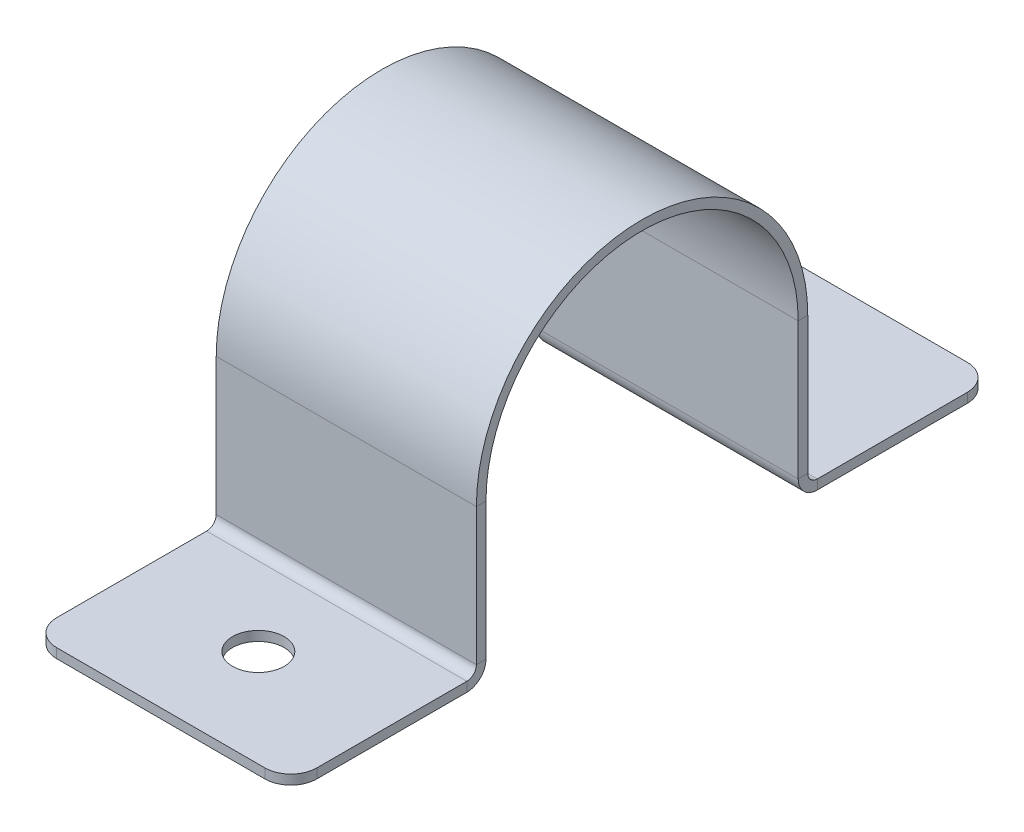
ISO-10303-21;
HEADER;
FILE_DESCRIPTION(('STEP AP214'),'2;1');
FILE_NAME('part.step','',(''),(''),'','','');
FILE_SCHEMA(('AUTOMOTIVE_DESIGN { 1 0 10303 214 1 1 1 1 }'));
ENDSEC;
DATA;
#1=APPLICATION_CONTEXT('core data for automotive mechanical design processes');
#2=APPLICATION_PROTOCOL_DEFINITION('international standard','automotive_design',2000,#1);
#3=PRODUCT_CONTEXT('',#1,'mechanical');
#4=PRODUCT('Part','Part','',(#3));
#5=PRODUCT_RELATED_PRODUCT_CATEGORY('part','',(#4));
#6=PRODUCT_DEFINITION_FORMATION('','',#4);
#7=PRODUCT_DEFINITION_CONTEXT('part definition',#1,'design');
#8=PRODUCT_DEFINITION('design','',#6,#7);
#9=PRODUCT_DEFINITION_SHAPE('','',#8);
#10=(LENGTH_UNIT() NAMED_UNIT(*) SI_UNIT(.MILLI.,.METRE.));
#11=(NAMED_UNIT(*) PLANE_ANGLE_UNIT() SI_UNIT($,.RADIAN.));
#12=(NAMED_UNIT(*) SI_UNIT($,.STERADIAN.) SOLID_ANGLE_UNIT());
#13=UNCERTAINTY_MEASURE_WITH_UNIT(LENGTH_MEASURE(1.E-05),#10,'distance_accuracy_value','');
#14=(GEOMETRIC_REPRESENTATION_CONTEXT(3) GLOBAL_UNCERTAINTY_ASSIGNED_CONTEXT((#13)) GLOBAL_UNIT_ASSIGNED_CONTEXT((#10,
#11,#12)) REPRESENTATION_CONTEXT('',''));
#15=CARTESIAN_POINT('',(0.,0.,0.));
#16=DIRECTION('',(0.,0.,1.));
#17=DIRECTION('',(1.,0.,0.));
#18=AXIS2_PLACEMENT_3D('',#15,#16,#17);
#19=CARTESIAN_POINT('',(10.,0.,-12.));
#20=DIRECTION('',(0.,1.,0.));
#21=DIRECTION('',(0.,0.,1.));
#22=AXIS2_PLACEMENT_3D('',#19,#20,#21);
#23=PLANE('',#22);
#24=DIRECTION('',(0.,0.,-1.));
#25=VECTOR('',#24,1.);
#26=CARTESIAN_POINT('',(-10.,0.,-12.));
#27=LINE('',#26,#25);
#28=CARTESIAN_POINT('',(-10.,0.,-13.4732));
#29=VERTEX_POINT('',#28);
#30=CARTESIAN_POINT('',(-10.,0.,-25.));
#31=VERTEX_POINT('',#30);
#32=EDGE_CURVE('E250',#29,#31,#27,.T.);
#33=ORIENTED_EDGE('',*,*,#32,.T.);
#34=CARTESIAN_POINT('',(-8.,0.,-25.));
#35=DIRECTION('',(0.,1.,0.));
#36=DIRECTION('',(0.,0.,1.));
#37=AXIS2_PLACEMENT_3D('',#34,#35,#36);
#38=CIRCLE('',#37,2.);
#39=CARTESIAN_POINT('',(-8.,0.,-27.));
#40=VERTEX_POINT('',#39);
#41=EDGE_CURVE('E360',#31,#40,#38,.F.);
#42=ORIENTED_EDGE('',*,*,#41,.T.);
#43=DIRECTION('',(-1.,0.,0.));
#44=VECTOR('',#43,1.);
#45=CARTESIAN_POINT('',(10.,0.,-27.));
#46=LINE('',#45,#44);
#47=CARTESIAN_POINT('',(8.,0.,-27.));
#48=VERTEX_POINT('',#47);
#49=EDGE_CURVE('E324',#48,#40,#46,.T.);
#50=ORIENTED_EDGE('',*,*,#49,.F.);
#51=CARTESIAN_POINT('',(8.,0.,-25.));
#52=DIRECTION('',(0.,1.,0.));
#53=DIRECTION('',(0.,0.,1.));
#54=AXIS2_PLACEMENT_3D('',#51,#52,#53);
#55=CIRCLE('',#54,2.);
#56=CARTESIAN_POINT('',(10.,0.,-25.));
#57=VERTEX_POINT('',#56);
#58=EDGE_CURVE('E352',#48,#57,#55,.F.);
#59=ORIENTED_EDGE('',*,*,#58,.T.);
#60=DIRECTION('',(0.,0.,-1.));
#61=VECTOR('',#60,1.);
#62=CARTESIAN_POINT('',(10.,0.,-12.));
#63=LINE('',#62,#61);
#64=CARTESIAN_POINT('',(10.,0.,-13.4732));
#65=VERTEX_POINT('',#64);
#66=EDGE_CURVE('E213',#65,#57,#63,.T.);
#67=ORIENTED_EDGE('',*,*,#66,.F.);
#68=DIRECTION('',(-1.,0.,0.));
#69=VECTOR('',#68,1.);
#70=CARTESIAN_POINT('',(10.,0.,-13.4732));
#71=LINE('',#70,#69);
#72=EDGE_CURVE('E249',#65,#29,#71,.T.);
#73=ORIENTED_EDGE('',*,*,#72,.T.);
#74=EDGE_LOOP('',(#33,#42,#50,#59,#67,#73));
#75=FACE_BOUND('',#74,.T.);
#76=CARTESIAN_POINT('',(0.,0.,-19.5));
#77=DIRECTION('',(0.,-1.,0.));
#78=DIRECTION('',(0.,0.,-1.));
#79=AXIS2_PLACEMENT_3D('',#76,#77,#78);
#80=CIRCLE('',#79,1.984375);
#81=CARTESIAN_POINT('',(0.,0.,-21.484375));
#82=VERTEX_POINT('',#81);
#83=EDGE_CURVE('E443',#82,#82,#80,.T.);
#84=ORIENTED_EDGE('',*,*,#83,.F.);
#85=EDGE_LOOP('',(#84));
#86=FACE_BOUND('',#85,.T.);
#87=ADVANCED_FACE('F38',(#75,#86),#23,.F.);
#88=CARTESIAN_POINT('',(10.,0.736600000000001,-12.));
#89=DIRECTION('',(0.,1.,0.));
#90=DIRECTION('',(0.,0.,1.));
#91=AXIS2_PLACEMENT_3D('',#88,#89,#90);
#92=PLANE('',#91);
#93=DIRECTION('',(-1.,0.,0.));
#94=VECTOR('',#93,1.);
#95=CARTESIAN_POINT('',(10.,0.7366,-27.));
#96=LINE('',#95,#94);
#97=CARTESIAN_POINT('',(8.,0.7366,-27.));
#98=VERTEX_POINT('',#97);
#99=CARTESIAN_POINT('',(-8.,0.7366,-27.));
#100=VERTEX_POINT('',#99);
#101=EDGE_CURVE('E207',#98,#100,#96,.T.);
#102=ORIENTED_EDGE('',*,*,#101,.T.);
#103=CARTESIAN_POINT('',(-8.,0.7366,-25.));
#104=DIRECTION('',(0.,1.,0.));
#105=DIRECTION('',(0.,0.,1.));
#106=AXIS2_PLACEMENT_3D('',#103,#104,#105);
#107=CIRCLE('',#106,2.);
#108=CARTESIAN_POINT('',(-10.,0.7366,-25.));
#109=VERTEX_POINT('',#108);
#110=EDGE_CURVE('E364',#100,#109,#107,.T.);
#111=ORIENTED_EDGE('',*,*,#110,.T.);
#112=DIRECTION('',(0.,0.,-1.));
#113=VECTOR('',#112,1.);
#114=CARTESIAN_POINT('',(-10.,0.736600000000001,-12.));
#115=LINE('',#114,#113);
#116=CARTESIAN_POINT('',(-10.,0.736600000000001,-13.4732));
#117=VERTEX_POINT('',#116);
#118=EDGE_CURVE('E203',#117,#109,#115,.T.);
#119=ORIENTED_EDGE('',*,*,#118,.F.);
#120=DIRECTION('',(-1.,0.,0.));
#121=VECTOR('',#120,1.);
#122=CARTESIAN_POINT('',(10.,0.736600000000001,-13.4732));
#123=LINE('',#122,#121);
#124=CARTESIAN_POINT('',(10.,0.736600000000001,-13.4732));
#125=VERTEX_POINT('',#124);
#126=EDGE_CURVE('E196',#125,#117,#123,.T.);
#127=ORIENTED_EDGE('',*,*,#126,.F.);
#128=DIRECTION('',(0.,0.,-1.));
#129=VECTOR('',#128,1.);
#130=CARTESIAN_POINT('',(10.,0.736600000000001,-12.));
#131=LINE('',#130,#129);
#132=CARTESIAN_POINT('',(10.,0.7366,-25.));
#133=VERTEX_POINT('',#132);
#134=EDGE_CURVE('E200',#125,#133,#131,.T.);
#135=ORIENTED_EDGE('',*,*,#134,.T.);
#136=CARTESIAN_POINT('',(8.,0.7366,-25.));
#137=DIRECTION('',(0.,1.,0.));
#138=DIRECTION('',(0.,0.,1.));
#139=AXIS2_PLACEMENT_3D('',#136,#137,#138);
#140=CIRCLE('',#139,2.);
#141=EDGE_CURVE('E355',#133,#98,#140,.T.);
#142=ORIENTED_EDGE('',*,*,#141,.T.);
#143=EDGE_LOOP('',(#102,#111,#119,#127,#135,#142));
#144=FACE_BOUND('',#143,.T.);
#145=CARTESIAN_POINT('',(0.,0.7366,-19.5));
#146=DIRECTION('',(0.,-1.,0.));
#147=DIRECTION('',(0.,0.,-1.));
#148=AXIS2_PLACEMENT_3D('',#145,#146,#147);
#149=CIRCLE('',#148,1.984375);
#150=CARTESIAN_POINT('',(0.,0.7366,-21.484375));
#151=VERTEX_POINT('',#150);
#152=EDGE_CURVE('E446',#151,#151,#149,.T.);
#153=ORIENTED_EDGE('',*,*,#152,.T.);
#154=EDGE_LOOP('',(#153));
#155=FACE_BOUND('',#154,.T.);
#156=ADVANCED_FACE('F198',(#144,#155),#92,.T.);
#157=CARTESIAN_POINT('',(10.,12.,12.));
#158=DIRECTION('',(1.,0.,0.));
#159=DIRECTION('',(0.,0.,-1.));
#160=AXIS2_PLACEMENT_3D('',#157,#158,#159);
#161=PLANE('',#160);
#162=DIRECTION('',(0.,0.,1.));
#163=VECTOR('',#162,1.);
#164=CARTESIAN_POINT('',(10.,12.,12.));
#165=LINE('',#164,#163);
#166=CARTESIAN_POINT('',(10.,12.,12.));
#167=VERTEX_POINT('',#166);
#168=CARTESIAN_POINT('',(10.,12.,12.7366));
#169=VERTEX_POINT('',#168);
#170=EDGE_CURVE('E347',#167,#169,#165,.T.);
#171=ORIENTED_EDGE('',*,*,#170,.F.);
#172=CARTESIAN_POINT('',(10.,12.,0.));
#173=DIRECTION('',(-1.,0.,0.));
#174=DIRECTION('',(0.,0.,1.));
#175=AXIS2_PLACEMENT_3D('',#172,#173,#174);
#176=CIRCLE('',#175,12.);
#177=CARTESIAN_POINT('',(10.,12.,-12.));
#178=VERTEX_POINT('',#177);
#179=EDGE_CURVE('E242',#167,#178,#176,.T.);
#180=ORIENTED_EDGE('',*,*,#179,.T.);
#181=DIRECTION('',(0.,0.,1.));
#182=VECTOR('',#181,1.);
#183=CARTESIAN_POINT('',(10.,12.,-12.7366));
#184=LINE('',#183,#182);
#185=CARTESIAN_POINT('',(10.,12.,-12.7366));
#186=VERTEX_POINT('',#185);
#187=EDGE_CURVE('E345',#186,#178,#184,.T.);
#188=ORIENTED_EDGE('',*,*,#187,.F.);
#189=CARTESIAN_POINT('',(10.,12.,0.));
#190=DIRECTION('',(1.,0.,0.));
#191=DIRECTION('',(0.,0.,-1.));
#192=AXIS2_PLACEMENT_3D('',#189,#190,#191);
#193=CIRCLE('',#192,12.7366);
#194=EDGE_CURVE('E220',#169,#186,#193,.F.);
#195=ORIENTED_EDGE('',*,*,#194,.F.);
#196=EDGE_LOOP('',(#171,#180,#188,#195));
#197=FACE_BOUND('',#196,.T.);
#198=ADVANCED_FACE('F416',(#197),#161,.T.);
#199=CARTESIAN_POINT('',(10.,12.,-12.7366));
#200=DIRECTION('',(1.,0.,0.));
#201=DIRECTION('',(0.,0.,-1.));
#202=AXIS2_PLACEMENT_3D('',#199,#200,#201);
#203=PLANE('',#202);
#204=DIRECTION('',(0.,1.,0.));
#205=VECTOR('',#204,1.);
#206=CARTESIAN_POINT('',(10.,0.,12.));
#207=LINE('',#206,#205);
#208=CARTESIAN_POINT('',(10.,1.4732,12.));
#209=VERTEX_POINT('',#208);
#210=EDGE_CURVE('E239',#209,#167,#207,.T.);
#211=ORIENTED_EDGE('',*,*,#210,.T.);
#212=ORIENTED_EDGE('',*,*,#170,.T.);
#213=DIRECTION('',(0.,1.,0.));
#214=VECTOR('',#213,1.);
#215=CARTESIAN_POINT('',(10.,0.,12.7366));
#216=LINE('',#215,#214);
#217=CARTESIAN_POINT('',(10.,1.4732,12.7366));
#218=VERTEX_POINT('',#217);
#219=EDGE_CURVE('E226',#218,#169,#216,.T.);
#220=ORIENTED_EDGE('',*,*,#219,.F.);
#221=DIRECTION('',(0.,0.,-1.));
#222=VECTOR('',#221,1.);
#223=CARTESIAN_POINT('',(10.,1.4732,12.7366));
#224=LINE('',#223,#222);
#225=EDGE_CURVE('E336',#218,#209,#224,.T.);
#226=ORIENTED_EDGE('',*,*,#225,.T.);
#227=EDGE_LOOP('',(#211,#212,#220,#226));
#228=FACE_BOUND('',#227,.T.);
#229=ADVANCED_FACE('F407',(#228),#203,.T.);
#230=CARTESIAN_POINT('',(-10.,12.,-12.));
#231=DIRECTION('',(-1.,0.,0.));
#232=DIRECTION('',(0.,0.,1.));
#233=AXIS2_PLACEMENT_3D('',#230,#231,#232);
#234=PLANE('',#233);
#235=DIRECTION('',(0.,0.,-1.));
#236=VECTOR('',#235,1.);
#237=CARTESIAN_POINT('',(-10.,12.,-12.));
#238=LINE('',#237,#236);
#239=CARTESIAN_POINT('',(-10.,12.,-12.));
#240=VERTEX_POINT('',#239);
#241=CARTESIAN_POINT('',(-10.,12.,-12.7366));
#242=VERTEX_POINT('',#241);
#243=EDGE_CURVE('E343',#240,#242,#238,.T.);
#244=ORIENTED_EDGE('',*,*,#243,.F.);
#245=CARTESIAN_POINT('',(-10.,12.,0.));
#246=DIRECTION('',(-1.,0.,0.));
#247=DIRECTION('',(0.,0.,1.));
#248=AXIS2_PLACEMENT_3D('',#245,#246,#247);
#249=CIRCLE('',#248,12.);
#250=CARTESIAN_POINT('',(-10.,12.,12.));
#251=VERTEX_POINT('',#250);
#252=EDGE_CURVE('E279',#251,#240,#249,.T.);
#253=ORIENTED_EDGE('',*,*,#252,.F.);
#254=DIRECTION('',(0.,0.,-1.));
#255=VECTOR('',#254,1.);
#256=CARTESIAN_POINT('',(-10.,12.,12.7366));
#257=LINE('',#256,#255);
#258=CARTESIAN_POINT('',(-10.,12.,12.7366));
#259=VERTEX_POINT('',#258);
#260=EDGE_CURVE('E341',#259,#251,#257,.T.);
#261=ORIENTED_EDGE('',*,*,#260,.F.);
#262=CARTESIAN_POINT('',(-10.,12.,0.));
#263=DIRECTION('',(1.,0.,0.));
#264=DIRECTION('',(0.,0.,-1.));
#265=AXIS2_PLACEMENT_3D('',#262,#263,#264);
#266=CIRCLE('',#265,12.7366);
#267=EDGE_CURVE('E260',#259,#242,#266,.F.);
#268=ORIENTED_EDGE('',*,*,#267,.T.);
#269=EDGE_LOOP('',(#244,#253,#261,#268));
#270=FACE_BOUND('',#269,.T.);
#271=ADVANCED_FACE('F490',(#270),#234,.T.);
#272=CARTESIAN_POINT('',(-10.,12.,12.7366));
#273=DIRECTION('',(-1.,0.,0.));
#274=DIRECTION('',(0.,0.,1.));
#275=AXIS2_PLACEMENT_3D('',#272,#273,#274);
#276=PLANE('',#275);
#277=DIRECTION('',(0.,-1.,0.));
#278=VECTOR('',#277,1.);
#279=CARTESIAN_POINT('',(-10.,12.,-12.));
#280=LINE('',#279,#278);
#281=CARTESIAN_POINT('',(-10.,1.4732,-12.));
#282=VERTEX_POINT('',#281);
#283=EDGE_CURVE('E282',#240,#282,#280,.T.);
#284=ORIENTED_EDGE('',*,*,#283,.F.);
#285=ORIENTED_EDGE('',*,*,#243,.T.);
#286=DIRECTION('',(0.,-1.,0.));
#287=VECTOR('',#286,1.);
#288=CARTESIAN_POINT('',(-10.,12.,-12.7366));
#289=LINE('',#288,#287);
#290=CARTESIAN_POINT('',(-10.,1.4732,-12.7366));
#291=VERTEX_POINT('',#290);
#292=EDGE_CURVE('E257',#242,#291,#289,.T.);
#293=ORIENTED_EDGE('',*,*,#292,.T.);
#294=DIRECTION('',(0.,0.,1.));
#295=VECTOR('',#294,1.);
#296=CARTESIAN_POINT('',(-10.,1.4732,-12.7366));
#297=LINE('',#296,#295);
#298=EDGE_CURVE('E327',#291,#282,#297,.T.);
#299=ORIENTED_EDGE('',*,*,#298,.T.);
#300=EDGE_LOOP('',(#284,#285,#293,#299));
#301=FACE_BOUND('',#300,.T.);
#302=ADVANCED_FACE('F487',(#301),#276,.T.);
#303=CARTESIAN_POINT('',(10.,0.,13.4732));
#304=DIRECTION('',(1.,0.,0.));
#305=DIRECTION('',(0.,0.,-1.));
#306=AXIS2_PLACEMENT_3D('',#303,#304,#305);
#307=PLANE('',#306);
#308=DIRECTION('',(0.,1.,0.));
#309=VECTOR('',#308,1.);
#310=CARTESIAN_POINT('',(10.,0.,13.4732));
#311=LINE('',#310,#309);
#312=CARTESIAN_POINT('',(10.,0.,13.4732));
#313=VERTEX_POINT('',#312);
#314=CARTESIAN_POINT('',(10.,0.7366,13.4732));
#315=VERTEX_POINT('',#314);
#316=EDGE_CURVE('E338',#313,#315,#311,.T.);
#317=ORIENTED_EDGE('',*,*,#316,.F.);
#318=CARTESIAN_POINT('',(10.,1.4732,13.4732));
#319=DIRECTION('',(-1.,0.,0.));
#320=DIRECTION('',(0.,0.,1.));
#321=AXIS2_PLACEMENT_3D('',#318,#319,#320);
#322=CIRCLE('',#321,1.4732);
#323=EDGE_CURVE('E236',#313,#209,#322,.F.);
#324=ORIENTED_EDGE('',*,*,#323,.T.);
#325=ORIENTED_EDGE('',*,*,#225,.F.);
#326=CARTESIAN_POINT('',(10.,1.4732,13.4732));
#327=DIRECTION('',(1.,0.,0.));
#328=DIRECTION('',(0.,0.,-1.));
#329=AXIS2_PLACEMENT_3D('',#326,#327,#328);
#330=CIRCLE('',#329,0.7366);
#331=EDGE_CURVE('E229',#315,#218,#330,.T.);
#332=ORIENTED_EDGE('',*,*,#331,.F.);
#333=EDGE_LOOP('',(#317,#324,#325,#332));
#334=FACE_BOUND('',#333,.T.);
#335=ADVANCED_FACE('F398',(#334),#307,.T.);
#336=CARTESIAN_POINT('',(10.,1.4732,12.7366));
#337=DIRECTION('',(1.,0.,0.));
#338=DIRECTION('',(0.,0.,-1.));
#339=AXIS2_PLACEMENT_3D('',#336,#337,#338);
#340=PLANE('',#339);
#341=DIRECTION('',(0.,0.,-1.));
#342=VECTOR('',#341,1.);
#343=CARTESIAN_POINT('',(10.,0.7366,27.));
#344=LINE('',#343,#342);
#345=CARTESIAN_POINT('',(10.,0.7366,25.));
#346=VERTEX_POINT('',#345);
#347=EDGE_CURVE('E232',#346,#315,#344,.T.);
#348=ORIENTED_EDGE('',*,*,#347,.F.);
#349=DIRECTION('',(0.,1.,0.));
#350=VECTOR('',#349,1.);
#351=CARTESIAN_POINT('',(10.,1.4732,25.));
#352=LINE('',#351,#350);
#353=CARTESIAN_POINT('',(10.,0.,25.));
#354=VERTEX_POINT('',#353);
#355=EDGE_CURVE('E61',#346,#354,#352,.F.);
#356=ORIENTED_EDGE('',*,*,#355,.T.);
#357=DIRECTION('',(0.,0.,-1.));
#358=VECTOR('',#357,1.);
#359=CARTESIAN_POINT('',(10.,0.,27.));
#360=LINE('',#359,#358);
#361=EDGE_CURVE('E234',#354,#313,#360,.T.);
#362=ORIENTED_EDGE('',*,*,#361,.T.);
#363=ORIENTED_EDGE('',*,*,#316,.T.);
#364=EDGE_LOOP('',(#348,#356,#362,#363));
#365=FACE_BOUND('',#364,.T.);
#366=ADVANCED_FACE('F389',(#365),#340,.T.);
#367=CARTESIAN_POINT('',(-10.,1.4732,12.));
#368=DIRECTION('',(-1.,0.,0.));
#369=DIRECTION('',(0.,0.,1.));
#370=AXIS2_PLACEMENT_3D('',#367,#368,#369);
#371=PLANE('',#370);
#372=DIRECTION('',(0.,0.,1.));
#373=VECTOR('',#372,1.);
#374=CARTESIAN_POINT('',(-10.,1.4732,12.));
#375=LINE('',#374,#373);
#376=CARTESIAN_POINT('',(-10.,1.4732,12.));
#377=VERTEX_POINT('',#376);
#378=CARTESIAN_POINT('',(-10.,1.4732,12.7366));
#379=VERTEX_POINT('',#378);
#380=EDGE_CURVE('E334',#377,#379,#375,.T.);
#381=ORIENTED_EDGE('',*,*,#380,.F.);
#382=CARTESIAN_POINT('',(-10.,1.4732,13.4732));
#383=DIRECTION('',(-1.,0.,0.));
#384=DIRECTION('',(0.,0.,1.));
#385=AXIS2_PLACEMENT_3D('',#382,#383,#384);
#386=CIRCLE('',#385,1.4732);
#387=CARTESIAN_POINT('',(-10.,0.,13.4732));
#388=VERTEX_POINT('',#387);
#389=EDGE_CURVE('E273',#388,#377,#386,.F.);
#390=ORIENTED_EDGE('',*,*,#389,.F.);
#391=DIRECTION('',(0.,-1.,0.));
#392=VECTOR('',#391,1.);
#393=CARTESIAN_POINT('',(-10.,0.7366,13.4732));
#394=LINE('',#393,#392);
#395=CARTESIAN_POINT('',(-10.,0.7366,13.4732));
#396=VERTEX_POINT('',#395);
#397=EDGE_CURVE('E331',#396,#388,#394,.T.);
#398=ORIENTED_EDGE('',*,*,#397,.F.);
#399=CARTESIAN_POINT('',(-10.,1.4732,13.4732));
#400=DIRECTION('',(1.,0.,0.));
#401=DIRECTION('',(0.,0.,-1.));
#402=AXIS2_PLACEMENT_3D('',#399,#400,#401);
#403=CIRCLE('',#402,0.7366);
#404=EDGE_CURVE('E266',#396,#379,#403,.T.);
#405=ORIENTED_EDGE('',*,*,#404,.T.);
#406=EDGE_LOOP('',(#381,#390,#398,#405));
#407=FACE_BOUND('',#406,.T.);
#408=ADVANCED_FACE('F478',(#407),#371,.T.);
#409=CARTESIAN_POINT('',(-10.,0.7366,13.4732));
#410=DIRECTION('',(-1.,0.,0.));
#411=DIRECTION('',(0.,0.,1.));
#412=AXIS2_PLACEMENT_3D('',#409,#410,#411);
#413=PLANE('',#412);
#414=DIRECTION('',(0.,1.,0.));
#415=VECTOR('',#414,1.);
#416=CARTESIAN_POINT('',(-10.,0.,12.));
#417=LINE('',#416,#415);
#418=EDGE_CURVE('E276',#377,#251,#417,.T.);
#419=ORIENTED_EDGE('',*,*,#418,.F.);
#420=ORIENTED_EDGE('',*,*,#380,.T.);
#421=DIRECTION('',(0.,1.,0.));
#422=VECTOR('',#421,1.);
#423=CARTESIAN_POINT('',(-10.,0.,12.7366));
#424=LINE('',#423,#422);
#425=EDGE_CURVE('E263',#379,#259,#424,.T.);
#426=ORIENTED_EDGE('',*,*,#425,.T.);
#427=ORIENTED_EDGE('',*,*,#260,.T.);
#428=EDGE_LOOP('',(#419,#420,#426,#427));
#429=FACE_BOUND('',#428,.T.);
#430=ADVANCED_FACE('F475',(#429),#413,.T.);
#431=CARTESIAN_POINT('',(10.,1.4732,-12.));
#432=DIRECTION('',(1.,0.,0.));
#433=DIRECTION('',(0.,0.,-1.));
#434=AXIS2_PLACEMENT_3D('',#431,#432,#433);
#435=PLANE('',#434);
#436=DIRECTION('',(0.,0.,-1.));
#437=VECTOR('',#436,1.);
#438=CARTESIAN_POINT('',(10.,1.4732,-12.));
#439=LINE('',#438,#437);
#440=CARTESIAN_POINT('',(10.,1.4732,-12.));
#441=VERTEX_POINT('',#440);
#442=CARTESIAN_POINT('',(10.,1.4732,-12.7366));
#443=VERTEX_POINT('',#442);
#444=EDGE_CURVE('E189',#441,#443,#439,.T.);
#445=ORIENTED_EDGE('',*,*,#444,.F.);
#446=CARTESIAN_POINT('',(10.,1.4732,-13.4732));
#447=DIRECTION('',(-1.,0.,0.));
#448=DIRECTION('',(0.,0.,1.));
#449=AXIS2_PLACEMENT_3D('',#446,#447,#448);
#450=CIRCLE('',#449,1.4732);
#451=EDGE_CURVE('E184',#441,#65,#450,.F.);
#452=ORIENTED_EDGE('',*,*,#451,.T.);
#453=DIRECTION('',(0.,-1.,0.));
#454=VECTOR('',#453,1.);
#455=CARTESIAN_POINT('',(10.,0.736600000000001,-13.4732));
#456=LINE('',#455,#454);
#457=EDGE_CURVE('E177',#125,#65,#456,.T.);
#458=ORIENTED_EDGE('',*,*,#457,.F.);
#459=CARTESIAN_POINT('',(10.,1.4732,-13.4732));
#460=DIRECTION('',(1.,0.,0.));
#461=DIRECTION('',(0.,0.,-1.));
#462=AXIS2_PLACEMENT_3D('',#459,#460,#461);
#463=CIRCLE('',#462,0.7366);
#464=EDGE_CURVE('E181',#443,#125,#463,.T.);
#465=ORIENTED_EDGE('',*,*,#464,.F.);
#466=EDGE_LOOP('',(#445,#452,#458,#465));
#467=FACE_BOUND('',#466,.T.);
#468=ADVANCED_FACE('F179',(#467),#435,.T.);
#469=CARTESIAN_POINT('',(10.,0.736600000000001,-13.4732));
#470=DIRECTION('',(1.,0.,0.));
#471=DIRECTION('',(0.,0.,-1.));
#472=AXIS2_PLACEMENT_3D('',#469,#470,#471);
#473=PLANE('',#472);
#474=DIRECTION('',(0.,-1.,0.));
#475=VECTOR('',#474,1.);
#476=CARTESIAN_POINT('',(10.,12.,-12.));
#477=LINE('',#476,#475);
#478=EDGE_CURVE('E245',#178,#441,#477,.T.);
#479=ORIENTED_EDGE('',*,*,#478,.T.);
#480=ORIENTED_EDGE('',*,*,#444,.T.);
#481=DIRECTION('',(0.,-1.,0.));
#482=VECTOR('',#481,1.);
#483=CARTESIAN_POINT('',(10.,12.,-12.7366));
#484=LINE('',#483,#482);
#485=EDGE_CURVE('E218',#186,#443,#484,.T.);
#486=ORIENTED_EDGE('',*,*,#485,.F.);
#487=ORIENTED_EDGE('',*,*,#187,.T.);
#488=EDGE_LOOP('',(#479,#480,#486,#487));
#489=FACE_BOUND('',#488,.T.);
#490=ADVANCED_FACE('F425',(#489),#473,.T.);
#491=CARTESIAN_POINT('',(-10.,0.,-13.4732));
#492=DIRECTION('',(-1.,0.,0.));
#493=DIRECTION('',(0.,0.,1.));
#494=AXIS2_PLACEMENT_3D('',#491,#492,#493);
#495=PLANE('',#494);
#496=DIRECTION('',(0.,1.,0.));
#497=VECTOR('',#496,1.);
#498=CARTESIAN_POINT('',(-10.,0.,-13.4732));
#499=LINE('',#498,#497);
#500=EDGE_CURVE('E190',#29,#117,#499,.T.);
#501=ORIENTED_EDGE('',*,*,#500,.F.);
#502=CARTESIAN_POINT('',(-10.,1.4732,-13.4732));
#503=DIRECTION('',(-1.,0.,0.));
#504=DIRECTION('',(0.,0.,1.));
#505=AXIS2_PLACEMENT_3D('',#502,#503,#504);
#506=CIRCLE('',#505,1.4732);
#507=EDGE_CURVE('E285',#282,#29,#506,.F.);
#508=ORIENTED_EDGE('',*,*,#507,.F.);
#509=ORIENTED_EDGE('',*,*,#298,.F.);
#510=CARTESIAN_POINT('',(-10.,1.4732,-13.4732));
#511=DIRECTION('',(1.,0.,0.));
#512=DIRECTION('',(0.,0.,-1.));
#513=AXIS2_PLACEMENT_3D('',#510,#511,#512);
#514=CIRCLE('',#513,0.7366);
#515=EDGE_CURVE('E255',#291,#117,#514,.T.);
#516=ORIENTED_EDGE('',*,*,#515,.T.);
#517=EDGE_LOOP('',(#501,#508,#509,#516));
#518=FACE_BOUND('',#517,.T.);
#519=ADVANCED_FACE('F466',(#518),#495,.T.);
#520=CARTESIAN_POINT('',(-10.,1.4732,-12.7366));
#521=DIRECTION('',(-1.,0.,0.));
#522=DIRECTION('',(0.,0.,1.));
#523=AXIS2_PLACEMENT_3D('',#520,#521,#522);
#524=PLANE('',#523);
#525=ORIENTED_EDGE('',*,*,#118,.T.);
#526=DIRECTION('',(0.,-1.,0.));
#527=VECTOR('',#526,1.);
#528=CARTESIAN_POINT('',(-10.,1.4732,-25.));
#529=LINE('',#528,#527);
#530=EDGE_CURVE('E357',#109,#31,#529,.T.);
#531=ORIENTED_EDGE('',*,*,#530,.T.);
#532=ORIENTED_EDGE('',*,*,#32,.F.);
#533=ORIENTED_EDGE('',*,*,#500,.T.);
#534=EDGE_LOOP('',(#525,#531,#532,#533));
#535=FACE_BOUND('',#534,.T.);
#536=ADVANCED_FACE('F463',(#535),#524,.T.);
#537=CARTESIAN_POINT('',(10.,0.7366,-27.));
#538=DIRECTION('',(0.,0.,-1.));
#539=DIRECTION('',(-1.,0.,0.));
#540=AXIS2_PLACEMENT_3D('',#537,#538,#539);
#541=PLANE('',#540);
#542=ORIENTED_EDGE('',*,*,#49,.T.);
#543=DIRECTION('',(0.,-1.,0.));
#544=VECTOR('',#543,1.);
#545=CARTESIAN_POINT('',(-8.,0.7366,-27.));
#546=LINE('',#545,#544);
#547=EDGE_CURVE('E362',#40,#100,#546,.F.);
#548=ORIENTED_EDGE('',*,*,#547,.T.);
#549=ORIENTED_EDGE('',*,*,#101,.F.);
#550=DIRECTION('',(0.,-1.,0.));
#551=VECTOR('',#550,1.);
#552=CARTESIAN_POINT('',(8.,0.7366,-27.));
#553=LINE('',#552,#551);
#554=EDGE_CURVE('E349',#98,#48,#553,.T.);
#555=ORIENTED_EDGE('',*,*,#554,.T.);
#556=EDGE_LOOP('',(#542,#548,#549,#555));
#557=FACE_BOUND('',#556,.T.);
#558=ADVANCED_FACE('F462',(#557),#541,.T.);
#559=CARTESIAN_POINT('',(10.,1.4732,-13.4732));
#560=DIRECTION('',(-1.,0.,0.));
#561=DIRECTION('',(0.,0.,1.));
#562=AXIS2_PLACEMENT_3D('',#559,#560,#561);
#563=CYLINDRICAL_SURFACE('',#562,0.7366);
#564=ORIENTED_EDGE('',*,*,#515,.F.);
#565=DIRECTION('',(-1.,0.,0.));
#566=VECTOR('',#565,1.);
#567=CARTESIAN_POINT('',(10.,1.4732,-12.7366));
#568=LINE('',#567,#566);
#569=EDGE_CURVE('E208',#443,#291,#568,.T.);
#570=ORIENTED_EDGE('',*,*,#569,.F.);
#571=ORIENTED_EDGE('',*,*,#464,.T.);
#572=ORIENTED_EDGE('',*,*,#126,.T.);
#573=EDGE_LOOP('',(#564,#570,#571,#572));
#574=FACE_BOUND('',#573,.T.);
#575=ADVANCED_FACE('F216',(#574),#563,.F.);
#576=CARTESIAN_POINT('',(10.,12.,-12.7366));
#577=DIRECTION('',(0.,0.,-1.));
#578=DIRECTION('',(0.,1.,0.));
#579=AXIS2_PLACEMENT_3D('',#576,#577,#578);
#580=PLANE('',#579);
#581=ORIENTED_EDGE('',*,*,#292,.F.);
#582=DIRECTION('',(-1.,0.,0.));
#583=VECTOR('',#582,1.);
#584=CARTESIAN_POINT('',(10.,12.,-12.7366));
#585=LINE('',#584,#583);
#586=EDGE_CURVE('E319',#186,#242,#585,.T.);
#587=ORIENTED_EDGE('',*,*,#586,.F.);
#588=ORIENTED_EDGE('',*,*,#485,.T.);
#589=ORIENTED_EDGE('',*,*,#569,.T.);
#590=EDGE_LOOP('',(#581,#587,#588,#589));
#591=FACE_BOUND('',#590,.T.);
#592=ADVANCED_FACE('F424',(#591),#580,.T.);
#593=CARTESIAN_POINT('',(10.,12.,0.));
#594=DIRECTION('',(-1.,0.,0.));
#595=DIRECTION('',(0.,0.,1.));
#596=AXIS2_PLACEMENT_3D('',#593,#594,#595);
#597=CYLINDRICAL_SURFACE('',#596,12.7366);
#598=ORIENTED_EDGE('',*,*,#267,.F.);
#599=DIRECTION('',(-1.,0.,0.));
#600=VECTOR('',#599,1.);
#601=CARTESIAN_POINT('',(10.,12.,12.7366));
#602=LINE('',#601,#600);
#603=EDGE_CURVE('E316',#169,#259,#602,.T.);
#604=ORIENTED_EDGE('',*,*,#603,.F.);
#605=ORIENTED_EDGE('',*,*,#194,.T.);
#606=ORIENTED_EDGE('',*,*,#586,.T.);
#607=EDGE_LOOP('',(#598,#604,#605,#606));
#608=FACE_BOUND('',#607,.T.);
#609=ADVANCED_FACE('F415',(#608),#597,.T.);
#610=CARTESIAN_POINT('',(10.,0.,12.7366));
#611=DIRECTION('',(0.,0.,1.));
#612=DIRECTION('',(0.,-1.,0.));
#613=AXIS2_PLACEMENT_3D('',#610,#611,#612);
#614=PLANE('',#613);
#615=ORIENTED_EDGE('',*,*,#425,.F.);
#616=DIRECTION('',(-1.,0.,0.));
#617=VECTOR('',#616,1.);
#618=CARTESIAN_POINT('',(10.,1.4732,12.7366));
#619=LINE('',#618,#617);
#620=EDGE_CURVE('E313',#218,#379,#619,.T.);
#621=ORIENTED_EDGE('',*,*,#620,.F.);
#622=ORIENTED_EDGE('',*,*,#219,.T.);
#623=ORIENTED_EDGE('',*,*,#603,.T.);
#624=EDGE_LOOP('',(#615,#621,#622,#623));
#625=FACE_BOUND('',#624,.T.);
#626=ADVANCED_FACE('F406',(#625),#614,.T.);
#627=CARTESIAN_POINT('',(10.,1.4732,13.4732));
#628=DIRECTION('',(-1.,0.,0.));
#629=DIRECTION('',(0.,0.,1.));
#630=AXIS2_PLACEMENT_3D('',#627,#628,#629);
#631=CYLINDRICAL_SURFACE('',#630,0.7366);
#632=ORIENTED_EDGE('',*,*,#404,.F.);
#633=DIRECTION('',(-1.,0.,0.));
#634=VECTOR('',#633,1.);
#635=CARTESIAN_POINT('',(10.,0.7366,13.4732));
#636=LINE('',#635,#634);
#637=EDGE_CURVE('E310',#315,#396,#636,.T.);
#638=ORIENTED_EDGE('',*,*,#637,.F.);
#639=ORIENTED_EDGE('',*,*,#331,.T.);
#640=ORIENTED_EDGE('',*,*,#620,.T.);
#641=EDGE_LOOP('',(#632,#638,#639,#640));
#642=FACE_BOUND('',#641,.T.);
#643=ADVANCED_FACE('F396',(#642),#631,.F.);
#644=CARTESIAN_POINT('',(10.,0.7366,27.));
#645=DIRECTION('',(0.,1.,0.));
#646=DIRECTION('',(0.,0.,1.));
#647=AXIS2_PLACEMENT_3D('',#644,#645,#646);
#648=PLANE('',#647);
#649=CARTESIAN_POINT('',(0.,0.7366,19.5));
#650=DIRECTION('',(0.,1.,0.));
#651=DIRECTION('',(0.,0.,1.));
#652=AXIS2_PLACEMENT_3D('',#649,#650,#651);
#653=CIRCLE('',#652,1.984375);
#654=CARTESIAN_POINT('',(0.,0.7366,21.484375));
#655=VERTEX_POINT('',#654);
#656=EDGE_CURVE('E440',#655,#655,#653,.T.);
#657=ORIENTED_EDGE('',*,*,#656,.F.);
#658=EDGE_LOOP('',(#657));
#659=FACE_BOUND('',#658,.T.);
#660=DIRECTION('',(-1.,0.,0.));
#661=VECTOR('',#660,1.);
#662=CARTESIAN_POINT('',(10.,0.7366,27.));
#663=LINE('',#662,#661);
#664=CARTESIAN_POINT('',(8.,0.7366,27.));
#665=VERTEX_POINT('',#664);
#666=CARTESIAN_POINT('',(-8.,0.7366,27.));
#667=VERTEX_POINT('',#666);
#668=EDGE_CURVE('E307',#665,#667,#663,.T.);
#669=ORIENTED_EDGE('',*,*,#668,.F.);
#670=CARTESIAN_POINT('',(8.,0.7366,25.));
#671=DIRECTION('',(0.,1.,0.));
#672=DIRECTION('',(0.,0.,1.));
#673=AXIS2_PLACEMENT_3D('',#670,#671,#672);
#674=CIRCLE('',#673,2.);
#675=EDGE_CURVE('E373',#665,#346,#674,.T.);
#676=ORIENTED_EDGE('',*,*,#675,.T.);
#677=ORIENTED_EDGE('',*,*,#347,.T.);
#678=ORIENTED_EDGE('',*,*,#637,.T.);
#679=DIRECTION('',(0.,0.,-1.));
#680=VECTOR('',#679,1.);
#681=CARTESIAN_POINT('',(-10.,0.7366,27.));
#682=LINE('',#681,#680);
#683=CARTESIAN_POINT('',(-10.,0.7366,25.));
#684=VERTEX_POINT('',#683);
#685=EDGE_CURVE('E269',#684,#396,#682,.T.);
#686=ORIENTED_EDGE('',*,*,#685,.F.);
#687=CARTESIAN_POINT('',(-8.,0.7366,25.));
#688=DIRECTION('',(0.,1.,0.));
#689=DIRECTION('',(0.,0.,1.));
#690=AXIS2_PLACEMENT_3D('',#687,#688,#689);
#691=CIRCLE('',#690,2.);
#692=EDGE_CURVE('E371',#684,#667,#691,.T.);
#693=ORIENTED_EDGE('',*,*,#692,.T.);
#694=EDGE_LOOP('',(#669,#676,#677,#678,#686,#693));
#695=FACE_BOUND('',#694,.T.);
#696=ADVANCED_FACE('F388',(#659,#695),#648,.T.);
#697=CARTESIAN_POINT('',(10.,0.,27.));
#698=DIRECTION('',(0.,0.,1.));
#699=DIRECTION('',(1.,0.,0.));
#700=AXIS2_PLACEMENT_3D('',#697,#698,#699);
#701=PLANE('',#700);
#702=DIRECTION('',(-1.,0.,0.));
#703=VECTOR('',#702,1.);
#704=CARTESIAN_POINT('',(10.,0.,27.));
#705=LINE('',#704,#703);
#706=CARTESIAN_POINT('',(8.,0.,27.));
#707=VERTEX_POINT('',#706);
#708=CARTESIAN_POINT('',(-8.,0.,27.));
#709=VERTEX_POINT('',#708);
#710=EDGE_CURVE('E305',#707,#709,#705,.T.);
#711=ORIENTED_EDGE('',*,*,#710,.F.);
#712=DIRECTION('',(0.,1.,0.));
#713=VECTOR('',#712,1.);
#714=CARTESIAN_POINT('',(8.,0.,27.));
#715=LINE('',#714,#713);
#716=EDGE_CURVE('E368',#707,#665,#715,.T.);
#717=ORIENTED_EDGE('',*,*,#716,.T.);
#718=ORIENTED_EDGE('',*,*,#668,.T.);
#719=DIRECTION('',(0.,1.,0.));
#720=VECTOR('',#719,1.);
#721=CARTESIAN_POINT('',(-8.,0.,27.));
#722=LINE('',#721,#720);
#723=EDGE_CURVE('E366',#667,#709,#722,.F.);
#724=ORIENTED_EDGE('',*,*,#723,.T.);
#725=EDGE_LOOP('',(#711,#717,#718,#724));
#726=FACE_BOUND('',#725,.T.);
#727=ADVANCED_FACE('F383',(#726),#701,.T.);
#728=CARTESIAN_POINT('',(10.,0.,27.));
#729=DIRECTION('',(0.,1.,0.));
#730=DIRECTION('',(0.,0.,1.));
#731=AXIS2_PLACEMENT_3D('',#728,#729,#730);
#732=PLANE('',#731);
#733=CARTESIAN_POINT('',(0.,0.,19.5));
#734=DIRECTION('',(0.,1.,0.));
#735=DIRECTION('',(0.,0.,1.));
#736=AXIS2_PLACEMENT_3D('',#733,#734,#735);
#737=CIRCLE('',#736,1.984375);
#738=CARTESIAN_POINT('',(0.,0.,21.484375));
#739=VERTEX_POINT('',#738);
#740=EDGE_CURVE('E253',#739,#739,#737,.T.);
#741=ORIENTED_EDGE('',*,*,#740,.T.);
#742=EDGE_LOOP('',(#741));
#743=FACE_BOUND('',#742,.T.);
#744=ORIENTED_EDGE('',*,*,#361,.F.);
#745=CARTESIAN_POINT('',(8.,0.,25.));
#746=DIRECTION('',(0.,1.,0.));
#747=DIRECTION('',(0.,0.,1.));
#748=AXIS2_PLACEMENT_3D('',#745,#746,#747);
#749=CIRCLE('',#748,2.);
#750=EDGE_CURVE('E46',#354,#707,#749,.F.);
#751=ORIENTED_EDGE('',*,*,#750,.T.);
#752=ORIENTED_EDGE('',*,*,#710,.T.);
#753=CARTESIAN_POINT('',(-8.,0.,25.));
#754=DIRECTION('',(0.,1.,0.));
#755=DIRECTION('',(0.,0.,1.));
#756=AXIS2_PLACEMENT_3D('',#753,#754,#755);
#757=CIRCLE('',#756,2.);
#758=CARTESIAN_POINT('',(-10.,0.,25.));
#759=VERTEX_POINT('',#758);
#760=EDGE_CURVE('E53',#709,#759,#757,.F.);
#761=ORIENTED_EDGE('',*,*,#760,.T.);
#762=DIRECTION('',(0.,0.,-1.));
#763=VECTOR('',#762,1.);
#764=CARTESIAN_POINT('',(-10.,0.,27.));
#765=LINE('',#764,#763);
#766=EDGE_CURVE('E271',#759,#388,#765,.T.);
#767=ORIENTED_EDGE('',*,*,#766,.T.);
#768=DIRECTION('',(-1.,0.,0.));
#769=VECTOR('',#768,1.);
#770=CARTESIAN_POINT('',(10.,0.,13.4732));
#771=LINE('',#770,#769);
#772=EDGE_CURVE('E302',#313,#388,#771,.T.);
#773=ORIENTED_EDGE('',*,*,#772,.F.);
#774=EDGE_LOOP('',(#744,#751,#752,#761,#767,#773));
#775=FACE_BOUND('',#774,.T.);
#776=ADVANCED_FACE('F378',(#743,#775),#732,.F.);
#777=CARTESIAN_POINT('',(10.,1.4732,13.4732));
#778=DIRECTION('',(-1.,0.,0.));
#779=DIRECTION('',(0.,0.,1.));
#780=AXIS2_PLACEMENT_3D('',#777,#778,#779);
#781=CYLINDRICAL_SURFACE('',#780,1.4732);
#782=ORIENTED_EDGE('',*,*,#389,.T.);
#783=DIRECTION('',(-1.,0.,0.));
#784=VECTOR('',#783,1.);
#785=CARTESIAN_POINT('',(10.,1.4732,12.));
#786=LINE('',#785,#784);
#787=EDGE_CURVE('E299',#209,#377,#786,.T.);
#788=ORIENTED_EDGE('',*,*,#787,.F.);
#789=ORIENTED_EDGE('',*,*,#323,.F.);
#790=ORIENTED_EDGE('',*,*,#772,.T.);
#791=EDGE_LOOP('',(#782,#788,#789,#790));
#792=FACE_BOUND('',#791,.T.);
#793=ADVANCED_FACE('F519',(#792),#781,.T.);
#794=CARTESIAN_POINT('',(10.,0.,12.));
#795=DIRECTION('',(0.,0.,1.));
#796=DIRECTION('',(0.,-1.,0.));
#797=AXIS2_PLACEMENT_3D('',#794,#795,#796);
#798=PLANE('',#797);
#799=ORIENTED_EDGE('',*,*,#418,.T.);
#800=DIRECTION('',(-1.,0.,0.));
#801=VECTOR('',#800,1.);
#802=CARTESIAN_POINT('',(10.,12.,12.));
#803=LINE('',#802,#801);
#804=EDGE_CURVE('E296',#167,#251,#803,.T.);
#805=ORIENTED_EDGE('',*,*,#804,.F.);
#806=ORIENTED_EDGE('',*,*,#210,.F.);
#807=ORIENTED_EDGE('',*,*,#787,.T.);
#808=EDGE_LOOP('',(#799,#805,#806,#807));
#809=FACE_BOUND('',#808,.T.);
#810=ADVANCED_FACE('F522',(#809),#798,.F.);
#811=CARTESIAN_POINT('',(10.,12.,0.));
#812=DIRECTION('',(-1.,0.,0.));
#813=DIRECTION('',(0.,0.,1.));
#814=AXIS2_PLACEMENT_3D('',#811,#812,#813);
#815=CYLINDRICAL_SURFACE('',#814,12.);
#816=ORIENTED_EDGE('',*,*,#252,.T.);
#817=DIRECTION('',(-1.,0.,0.));
#818=VECTOR('',#817,1.);
#819=CARTESIAN_POINT('',(10.,12.,-12.));
#820=LINE('',#819,#818);
#821=EDGE_CURVE('E293',#178,#240,#820,.T.);
#822=ORIENTED_EDGE('',*,*,#821,.F.);
#823=ORIENTED_EDGE('',*,*,#179,.F.);
#824=ORIENTED_EDGE('',*,*,#804,.T.);
#825=EDGE_LOOP('',(#816,#822,#823,#824));
#826=FACE_BOUND('',#825,.T.);
#827=ADVANCED_FACE('F525',(#826),#815,.F.);
#828=CARTESIAN_POINT('',(10.,12.,-12.));
#829=DIRECTION('',(0.,0.,-1.));
#830=DIRECTION('',(0.,1.,0.));
#831=AXIS2_PLACEMENT_3D('',#828,#829,#830);
#832=PLANE('',#831);
#833=ORIENTED_EDGE('',*,*,#283,.T.);
#834=DIRECTION('',(-1.,0.,0.));
#835=VECTOR('',#834,1.);
#836=CARTESIAN_POINT('',(10.,1.4732,-12.));
#837=LINE('',#836,#835);
#838=EDGE_CURVE('E290',#441,#282,#837,.T.);
#839=ORIENTED_EDGE('',*,*,#838,.F.);
#840=ORIENTED_EDGE('',*,*,#478,.F.);
#841=ORIENTED_EDGE('',*,*,#821,.T.);
#842=EDGE_LOOP('',(#833,#839,#840,#841));
#843=FACE_BOUND('',#842,.T.);
#844=ADVANCED_FACE('F429',(#843),#832,.F.);
#845=CARTESIAN_POINT('',(10.,1.4732,-13.4732));
#846=DIRECTION('',(-1.,0.,0.));
#847=DIRECTION('',(0.,0.,1.));
#848=AXIS2_PLACEMENT_3D('',#845,#846,#847);
#849=CYLINDRICAL_SURFACE('',#848,1.4732);
#850=ORIENTED_EDGE('',*,*,#507,.T.);
#851=ORIENTED_EDGE('',*,*,#72,.F.);
#852=ORIENTED_EDGE('',*,*,#451,.F.);
#853=ORIENTED_EDGE('',*,*,#838,.T.);
#854=EDGE_LOOP('',(#850,#851,#852,#853));
#855=FACE_BOUND('',#854,.T.);
#856=ADVANCED_FACE('F433',(#855),#849,.T.);
#857=CARTESIAN_POINT('',(10.,1.4732,-13.4732));
#858=DIRECTION('',(1.,0.,0.));
#859=DIRECTION('',(0.,0.,-1.));
#860=AXIS2_PLACEMENT_3D('',#857,#858,#859);
#861=PLANE('',#860);
#862=ORIENTED_EDGE('',*,*,#66,.T.);
#863=DIRECTION('',(0.,-1.,0.));
#864=VECTOR('',#863,1.);
#865=CARTESIAN_POINT('',(10.,1.4732,-25.));
#866=LINE('',#865,#864);
#867=EDGE_CURVE('E212',#57,#133,#866,.F.);
#868=ORIENTED_EDGE('',*,*,#867,.T.);
#869=ORIENTED_EDGE('',*,*,#134,.F.);
#870=ORIENTED_EDGE('',*,*,#457,.T.);
#871=EDGE_LOOP('',(#862,#868,#869,#870));
#872=FACE_BOUND('',#871,.T.);
#873=ADVANCED_FACE('F210',(#872),#861,.T.);
#874=CARTESIAN_POINT('',(-10.,1.4732,-13.4732));
#875=DIRECTION('',(1.,0.,0.));
#876=DIRECTION('',(0.,0.,-1.));
#877=AXIS2_PLACEMENT_3D('',#874,#875,#876);
#878=PLANE('',#877);
#879=ORIENTED_EDGE('',*,*,#766,.F.);
#880=DIRECTION('',(0.,1.,0.));
#881=VECTOR('',#880,1.);
#882=CARTESIAN_POINT('',(-10.,0.7366,25.));
#883=LINE('',#882,#881);
#884=EDGE_CURVE('E11',#759,#684,#883,.T.);
#885=ORIENTED_EDGE('',*,*,#884,.T.);
#886=ORIENTED_EDGE('',*,*,#685,.T.);
#887=ORIENTED_EDGE('',*,*,#397,.T.);
#888=EDGE_LOOP('',(#879,#885,#886,#887));
#889=FACE_BOUND('',#888,.T.);
#890=ADVANCED_FACE('F515',(#889),#878,.F.);
#891=CARTESIAN_POINT('',(0.,0.,19.5));
#892=DIRECTION('',(0.,1.,0.));
#893=DIRECTION('',(0.,0.,1.));
#894=AXIS2_PLACEMENT_3D('',#891,#892,#893);
#895=CYLINDRICAL_SURFACE('',#894,1.984375);
#896=ORIENTED_EDGE('',*,*,#740,.F.);
#897=EDGE_LOOP('',(#896));
#898=FACE_BOUND('',#897,.T.);
#899=ORIENTED_EDGE('',*,*,#656,.T.);
#900=EDGE_LOOP('',(#899));
#901=FACE_BOUND('',#900,.T.);
#902=ADVANCED_FACE('F568',(#898,#901),#895,.F.);
#903=CARTESIAN_POINT('',(0.,0.,-19.5));
#904=DIRECTION('',(0.,1.,0.));
#905=DIRECTION('',(0.,0.,1.));
#906=AXIS2_PLACEMENT_3D('',#903,#904,#905);
#907=CYLINDRICAL_SURFACE('',#906,1.984375);
#908=ORIENTED_EDGE('',*,*,#83,.T.);
#909=EDGE_LOOP('',(#908));
#910=FACE_BOUND('',#909,.T.);
#911=ORIENTED_EDGE('',*,*,#152,.F.);
#912=EDGE_LOOP('',(#911));
#913=FACE_BOUND('',#912,.T.);
#914=ADVANCED_FACE('F452',(#910,#913),#907,.F.);
#915=CARTESIAN_POINT('',(8.,0.7366,-25.));
#916=DIRECTION('',(0.,-1.,0.));
#917=DIRECTION('',(0.,0.,-1.));
#918=AXIS2_PLACEMENT_3D('',#915,#916,#917);
#919=CYLINDRICAL_SURFACE('',#918,2.);
#920=ORIENTED_EDGE('',*,*,#141,.F.);
#921=ORIENTED_EDGE('',*,*,#867,.F.);
#922=ORIENTED_EDGE('',*,*,#58,.F.);
#923=ORIENTED_EDGE('',*,*,#554,.F.);
#924=EDGE_LOOP('',(#920,#921,#922,#923));
#925=FACE_BOUND('',#924,.T.);
#926=ADVANCED_FACE('F499',(#925),#919,.T.);
#927=CARTESIAN_POINT('',(-8.,1.4732,-25.));
#928=DIRECTION('',(0.,-1.,0.));
#929=DIRECTION('',(0.,0.,-1.));
#930=AXIS2_PLACEMENT_3D('',#927,#928,#929);
#931=CYLINDRICAL_SURFACE('',#930,2.);
#932=ORIENTED_EDGE('',*,*,#110,.F.);
#933=ORIENTED_EDGE('',*,*,#547,.F.);
#934=ORIENTED_EDGE('',*,*,#41,.F.);
#935=ORIENTED_EDGE('',*,*,#530,.F.);
#936=EDGE_LOOP('',(#932,#933,#934,#935));
#937=FACE_BOUND('',#936,.T.);
#938=ADVANCED_FACE('F502',(#937),#931,.T.);
#939=CARTESIAN_POINT('',(8.,0.,25.));
#940=DIRECTION('',(0.,1.,0.));
#941=DIRECTION('',(0.,0.,1.));
#942=AXIS2_PLACEMENT_3D('',#939,#940,#941);
#943=CYLINDRICAL_SURFACE('',#942,2.);
#944=ORIENTED_EDGE('',*,*,#750,.F.);
#945=ORIENTED_EDGE('',*,*,#355,.F.);
#946=ORIENTED_EDGE('',*,*,#675,.F.);
#947=ORIENTED_EDGE('',*,*,#716,.F.);
#948=EDGE_LOOP('',(#944,#945,#946,#947));
#949=FACE_BOUND('',#948,.T.);
#950=ADVANCED_FACE('F386',(#949),#943,.T.);
#951=CARTESIAN_POINT('',(-8.,1.4732,25.));
#952=DIRECTION('',(0.,-1.,0.));
#953=DIRECTION('',(0.,0.,-1.));
#954=AXIS2_PLACEMENT_3D('',#951,#952,#953);
#955=CYLINDRICAL_SURFACE('',#954,2.);
#956=ORIENTED_EDGE('',*,*,#760,.F.);
#957=ORIENTED_EDGE('',*,*,#723,.F.);
#958=ORIENTED_EDGE('',*,*,#692,.F.);
#959=ORIENTED_EDGE('',*,*,#884,.F.);
#960=EDGE_LOOP('',(#956,#957,#958,#959));
#961=FACE_BOUND('',#960,.T.);
#962=ADVANCED_FACE('F40',(#961),#955,.T.);
#963=CLOSED_SHELL('',(#87,#156,#198,#229,#271,#302,#335,#366,#408,#430,#468,#490,#519,#536,#558,
#575,#592,#609,#626,#643,#696,#727,#776,#793,#810,#827,#844,#856,#873,#890,#902,#914,#926,#938,
#950,#962));
#964=MANIFOLD_SOLID_BREP('B2',#963);
#965=ADVANCED_BREP_SHAPE_REPRESENTATION('',(#18,#964),#14);
#966=SHAPE_DEFINITION_REPRESENTATION(#9,#965);
ENDSEC;
END-ISO-10303-21;
